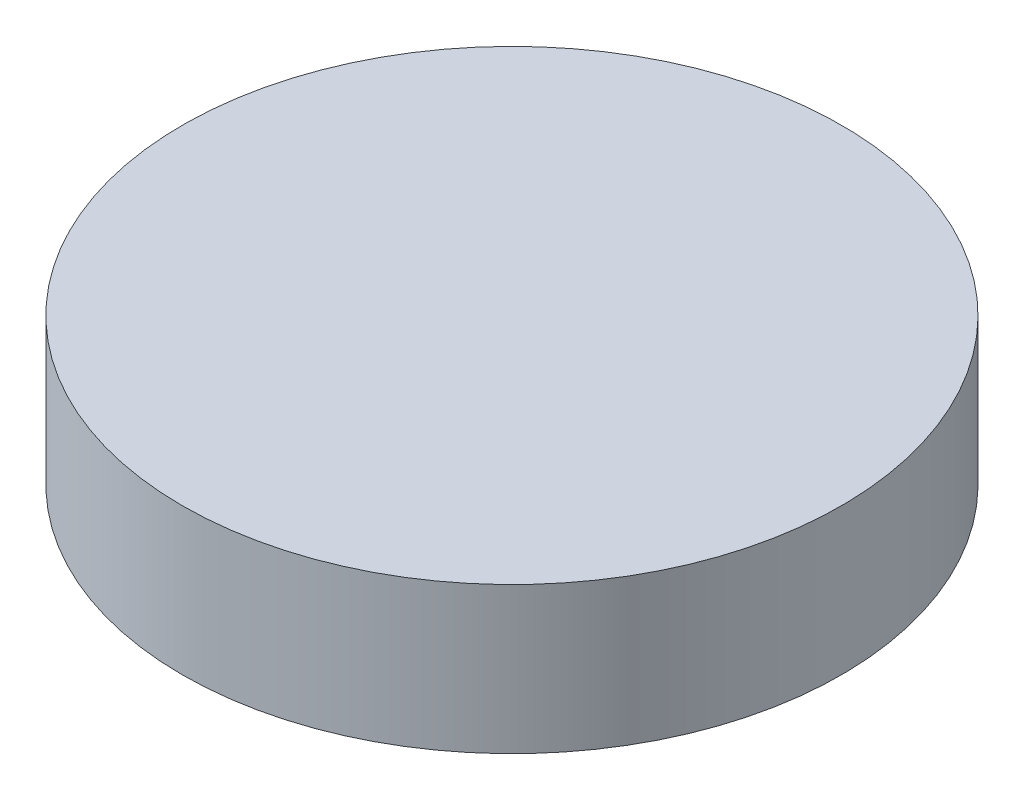
ISO-10303-21;
HEADER;
FILE_DESCRIPTION(('STEP AP214'),'2;1');
FILE_NAME('part.step','',(''),(''),'','','');
FILE_SCHEMA(('AUTOMOTIVE_DESIGN { 1 0 10303 214 1 1 1 1 }'));
ENDSEC;
DATA;
#1=APPLICATION_CONTEXT('core data for automotive mechanical design processes');
#2=APPLICATION_PROTOCOL_DEFINITION('international standard','automotive_design',2000,#1);
#3=PRODUCT_CONTEXT('',#1,'mechanical');
#4=PRODUCT('Part','Part','',(#3));
#5=PRODUCT_RELATED_PRODUCT_CATEGORY('part','',(#4));
#6=PRODUCT_DEFINITION_FORMATION('','',#4);
#7=PRODUCT_DEFINITION_CONTEXT('part definition',#1,'design');
#8=PRODUCT_DEFINITION('design','',#6,#7);
#9=PRODUCT_DEFINITION_SHAPE('','',#8);
#10=(LENGTH_UNIT() NAMED_UNIT(*) SI_UNIT(.MILLI.,.METRE.));
#11=(NAMED_UNIT(*) PLANE_ANGLE_UNIT() SI_UNIT($,.RADIAN.));
#12=(NAMED_UNIT(*) SI_UNIT($,.STERADIAN.) SOLID_ANGLE_UNIT());
#13=UNCERTAINTY_MEASURE_WITH_UNIT(LENGTH_MEASURE(1.E-05),#10,'distance_accuracy_value','');
#14=(GEOMETRIC_REPRESENTATION_CONTEXT(3) GLOBAL_UNCERTAINTY_ASSIGNED_CONTEXT((#13)) GLOBAL_UNIT_ASSIGNED_CONTEXT((#10,
#11,#12)) REPRESENTATION_CONTEXT('',''));
#15=CARTESIAN_POINT('',(0.,0.,0.));
#16=DIRECTION('',(0.,0.,1.));
#17=DIRECTION('',(1.,0.,0.));
#18=AXIS2_PLACEMENT_3D('',#15,#16,#17);
#19=CARTESIAN_POINT('',(0.,40.,0.));
#20=DIRECTION('',(0.,-1.,0.));
#21=DIRECTION('',(0.,0.,-1.));
#22=AXIS2_PLACEMENT_3D('',#19,#20,#21);
#23=CYLINDRICAL_SURFACE('',#22,90.);
#24=CARTESIAN_POINT('',(0.,40.,0.));
#25=DIRECTION('',(0.,1.,0.));
#26=DIRECTION('',(0.,0.,1.));
#27=AXIS2_PLACEMENT_3D('',#24,#25,#26);
#28=CIRCLE('',#27,90.);
#29=CARTESIAN_POINT('',(0.,40.,90.));
#30=VERTEX_POINT('',#29);
#31=EDGE_CURVE('E53',#30,#30,#28,.T.);
#32=ORIENTED_EDGE('',*,*,#31,.F.);
#33=EDGE_LOOP('',(#32));
#34=FACE_BOUND('',#33,.T.);
#35=CARTESIAN_POINT('',(0.,0.,0.));
#36=DIRECTION('',(0.,1.,0.));
#37=DIRECTION('',(0.,0.,1.));
#38=AXIS2_PLACEMENT_3D('',#35,#36,#37);
#39=CIRCLE('',#38,90.);
#40=CARTESIAN_POINT('',(0.,0.,90.));
#41=VERTEX_POINT('',#40);
#42=EDGE_CURVE('E42',#41,#41,#39,.T.);
#43=ORIENTED_EDGE('',*,*,#42,.T.);
#44=EDGE_LOOP('',(#43));
#45=FACE_BOUND('',#44,.T.);
#46=ADVANCED_FACE('F39',(#34,#45),#23,.T.);
#47=CARTESIAN_POINT('',(0.,40.,0.));
#48=DIRECTION('',(0.,1.,0.));
#49=DIRECTION('',(0.,0.,1.));
#50=AXIS2_PLACEMENT_3D('',#47,#48,#49);
#51=PLANE('',#50);
#52=ORIENTED_EDGE('',*,*,#31,.T.);
#53=EDGE_LOOP('',(#52));
#54=FACE_BOUND('',#53,.T.);
#55=ADVANCED_FACE('F73',(#54),#51,.T.);
#56=CARTESIAN_POINT('',(0.,0.,0.));
#57=DIRECTION('',(0.,1.,0.));
#58=DIRECTION('',(0.,0.,1.));
#59=AXIS2_PLACEMENT_3D('',#56,#57,#58);
#60=PLANE('',#59);
#61=CARTESIAN_POINT('',(0.,0.,0.));
#62=DIRECTION('',(0.,-1.,0.));
#63=DIRECTION('',(0.,0.,-1.));
#64=AXIS2_PLACEMENT_3D('',#61,#62,#63);
#65=CIRCLE('',#64,25.);
#66=CARTESIAN_POINT('',(0.,0.,-25.));
#67=VERTEX_POINT('',#66);
#68=EDGE_CURVE('E47',#67,#67,#65,.T.);
#69=ORIENTED_EDGE('',*,*,#68,.F.);
#70=EDGE_LOOP('',(#69));
#71=FACE_BOUND('',#70,.T.);
#72=ORIENTED_EDGE('',*,*,#42,.F.);
#73=EDGE_LOOP('',(#72));
#74=FACE_BOUND('',#73,.T.);
#75=ADVANCED_FACE('F70',(#71,#74),#60,.F.);
#76=CARTESIAN_POINT('',(0.,-5.,0.));
#77=DIRECTION('',(0.,1.,0.));
#78=DIRECTION('',(0.,0.,1.));
#79=AXIS2_PLACEMENT_3D('',#76,#77,#78);
#80=CYLINDRICAL_SURFACE('',#79,25.);
#81=CARTESIAN_POINT('',(0.,-5.,0.));
#82=DIRECTION('',(0.,-1.,0.));
#83=DIRECTION('',(0.,0.,-1.));
#84=AXIS2_PLACEMENT_3D('',#81,#82,#83);
#85=CIRCLE('',#84,25.);
#86=CARTESIAN_POINT('',(0.,-5.,-25.));
#87=VERTEX_POINT('',#86);
#88=EDGE_CURVE('E58',#87,#87,#85,.T.);
#89=ORIENTED_EDGE('',*,*,#88,.F.);
#90=EDGE_LOOP('',(#89));
#91=FACE_BOUND('',#90,.T.);
#92=ORIENTED_EDGE('',*,*,#68,.T.);
#93=EDGE_LOOP('',(#92));
#94=FACE_BOUND('',#93,.T.);
#95=ADVANCED_FACE('F72',(#91,#94),#80,.T.);
#96=CARTESIAN_POINT('',(0.,-5.,0.));
#97=DIRECTION('',(0.,-1.,0.));
#98=DIRECTION('',(0.,0.,-1.));
#99=AXIS2_PLACEMENT_3D('',#96,#97,#98);
#100=PLANE('',#99);
#101=CARTESIAN_POINT('',(0.,-5.,0.));
#102=DIRECTION('',(0.,-1.,0.));
#103=DIRECTION('',(0.,0.,-1.));
#104=AXIS2_PLACEMENT_3D('',#101,#102,#103);
#105=CIRCLE('',#104,20.);
#106=CARTESIAN_POINT('',(0.,-5.,-20.));
#107=VERTEX_POINT('',#106);
#108=EDGE_CURVE('E10',#107,#107,#105,.T.);
#109=ORIENTED_EDGE('',*,*,#108,.F.);
#110=EDGE_LOOP('',(#109));
#111=FACE_BOUND('',#110,.T.);
#112=ORIENTED_EDGE('',*,*,#88,.T.);
#113=EDGE_LOOP('',(#112));
#114=FACE_BOUND('',#113,.T.);
#115=ADVANCED_FACE('F79',(#111,#114),#100,.T.);
#116=CARTESIAN_POINT('',(0.,-45.,0.));
#117=DIRECTION('',(0.,1.,0.));
#118=DIRECTION('',(0.,0.,1.));
#119=AXIS2_PLACEMENT_3D('',#116,#117,#118);
#120=CYLINDRICAL_SURFACE('',#119,20.);
#121=CARTESIAN_POINT('',(0.,-45.,0.));
#122=DIRECTION('',(0.,-1.,0.));
#123=DIRECTION('',(0.,0.,-1.));
#124=AXIS2_PLACEMENT_3D('',#121,#122,#123);
#125=CIRCLE('',#124,20.);
#126=CARTESIAN_POINT('',(0.,-45.,-20.));
#127=VERTEX_POINT('',#126);
#128=EDGE_CURVE('E57',#127,#127,#125,.T.);
#129=ORIENTED_EDGE('',*,*,#128,.F.);
#130=EDGE_LOOP('',(#129));
#131=FACE_BOUND('',#130,.T.);
#132=ORIENTED_EDGE('',*,*,#108,.T.);
#133=EDGE_LOOP('',(#132));
#134=FACE_BOUND('',#133,.T.);
#135=ADVANCED_FACE('F106',(#131,#134),#120,.T.);
#136=CARTESIAN_POINT('',(0.,-45.,0.));
#137=DIRECTION('',(0.,-1.,0.));
#138=DIRECTION('',(0.,0.,-1.));
#139=AXIS2_PLACEMENT_3D('',#136,#137,#138);
#140=PLANE('',#139);
#141=ORIENTED_EDGE('',*,*,#128,.T.);
#142=EDGE_LOOP('',(#141));
#143=FACE_BOUND('',#142,.T.);
#144=ADVANCED_FACE('F115',(#143),#140,.T.);
#145=CLOSED_SHELL('',(#46,#55,#75,#95,#115,#135,#144));
#146=MANIFOLD_SOLID_BREP('B2',#145);
#147=ADVANCED_BREP_SHAPE_REPRESENTATION('',(#18,#146),#14);
#148=SHAPE_DEFINITION_REPRESENTATION(#9,#147);
ENDSEC;
END-ISO-10303-21;
